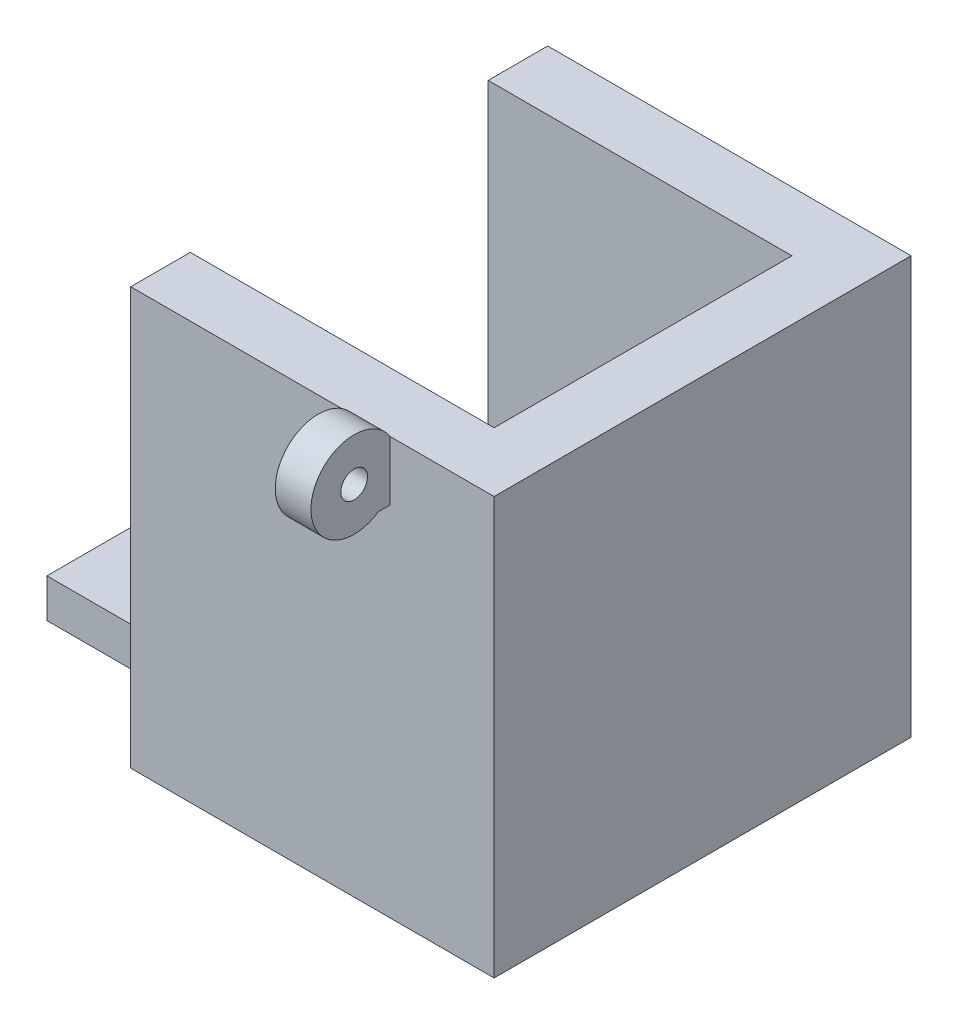
ISO-10303-21;
HEADER;
FILE_DESCRIPTION(('STEP AP214'),'2;1');
FILE_NAME('part.step','',(''),(''),'','','');
FILE_SCHEMA(('AUTOMOTIVE_DESIGN { 1 0 10303 214 1 1 1 1 }'));
ENDSEC;
DATA;
#1=APPLICATION_CONTEXT('core data for automotive mechanical design processes');
#2=APPLICATION_PROTOCOL_DEFINITION('international standard','automotive_design',2000,#1);
#3=PRODUCT_CONTEXT('',#1,'mechanical');
#4=PRODUCT('Part','Part','',(#3));
#5=PRODUCT_RELATED_PRODUCT_CATEGORY('part','',(#4));
#6=PRODUCT_DEFINITION_FORMATION('','',#4);
#7=PRODUCT_DEFINITION_CONTEXT('part definition',#1,'design');
#8=PRODUCT_DEFINITION('design','',#6,#7);
#9=PRODUCT_DEFINITION_SHAPE('','',#8);
#10=(LENGTH_UNIT() NAMED_UNIT(*) SI_UNIT(.MILLI.,.METRE.));
#11=(NAMED_UNIT(*) PLANE_ANGLE_UNIT() SI_UNIT($,.RADIAN.));
#12=(NAMED_UNIT(*) SI_UNIT($,.STERADIAN.) SOLID_ANGLE_UNIT());
#13=UNCERTAINTY_MEASURE_WITH_UNIT(LENGTH_MEASURE(1.E-05),#10,'distance_accuracy_value','');
#14=(GEOMETRIC_REPRESENTATION_CONTEXT(3) GLOBAL_UNCERTAINTY_ASSIGNED_CONTEXT((#13)) GLOBAL_UNIT_ASSIGNED_CONTEXT((#10,
#11,#12)) REPRESENTATION_CONTEXT('',''));
#15=CARTESIAN_POINT('',(0.,0.,0.));
#16=DIRECTION('',(0.,0.,1.));
#17=DIRECTION('',(1.,0.,0.));
#18=AXIS2_PLACEMENT_3D('',#15,#16,#17);
#19=CARTESIAN_POINT('',(40.5365853658537,0.,77.3902439024391));
#20=DIRECTION('',(1.,0.,0.));
#21=DIRECTION('',(0.,0.,-1.));
#22=AXIS2_PLACEMENT_3D('',#19,#20,#21);
#23=PLANE('',#22);
#24=DIRECTION('',(0.,0.,-1.));
#25=VECTOR('',#24,1.);
#26=CARTESIAN_POINT('',(40.5365853658537,140.,77.3902439024391));
#27=LINE('',#26,#25);
#28=CARTESIAN_POINT('',(40.5365853658537,140.,-42.609756097561));
#29=VERTEX_POINT('',#28);
#30=CARTESIAN_POINT('',(40.5365853658537,140.,-62.609756097561));
#31=VERTEX_POINT('',#30);
#32=EDGE_CURVE('E171',#29,#31,#27,.T.);
#33=ORIENTED_EDGE('',*,*,#32,.T.);
#34=DIRECTION('',(0.,1.,0.));
#35=VECTOR('',#34,1.);
#36=CARTESIAN_POINT('',(40.5365853658537,0.,-62.609756097561));
#37=LINE('',#36,#35);
#38=CARTESIAN_POINT('',(40.5365853658537,0.,-62.609756097561));
#39=VERTEX_POINT('',#38);
#40=EDGE_CURVE('E183',#39,#31,#37,.T.);
#41=ORIENTED_EDGE('',*,*,#40,.F.);
#42=DIRECTION('',(0.,0.,-1.));
#43=VECTOR('',#42,1.);
#44=CARTESIAN_POINT('',(40.5365853658537,0.,77.3902439024391));
#45=LINE('',#44,#43);
#46=CARTESIAN_POINT('',(40.5365853658537,0.,77.3902439024391));
#47=VERTEX_POINT('',#46);
#48=EDGE_CURVE('E179',#47,#39,#45,.T.);
#49=ORIENTED_EDGE('',*,*,#48,.F.);
#50=DIRECTION('',(0.,1.,0.));
#51=VECTOR('',#50,1.);
#52=CARTESIAN_POINT('',(40.5365853658537,0.,77.3902439024391));
#53=LINE('',#52,#51);
#54=CARTESIAN_POINT('',(40.5365853658537,140.,77.3902439024391));
#55=VERTEX_POINT('',#54);
#56=EDGE_CURVE('E181',#47,#55,#53,.T.);
#57=ORIENTED_EDGE('',*,*,#56,.T.);
#58=CARTESIAN_POINT('',(40.5365853658537,140.,57.390243902439));
#59=VERTEX_POINT('',#58);
#60=EDGE_CURVE('E173',#55,#59,#27,.T.);
#61=ORIENTED_EDGE('',*,*,#60,.T.);
#62=DIRECTION('',(0.,1.,0.));
#63=VECTOR('',#62,1.);
#64=CARTESIAN_POINT('',(40.5365853658537,30.,57.390243902439));
#65=LINE('',#64,#63);
#66=CARTESIAN_POINT('',(40.5365853658537,30.,57.390243902439));
#67=VERTEX_POINT('',#66);
#68=EDGE_CURVE('E186',#67,#59,#65,.T.);
#69=ORIENTED_EDGE('',*,*,#68,.F.);
#70=DIRECTION('',(0.,0.,-1.));
#71=VECTOR('',#70,1.);
#72=CARTESIAN_POINT('',(40.5365853658537,30.,0.));
#73=LINE('',#72,#71);
#74=CARTESIAN_POINT('',(40.5365853658537,30.,-42.609756097561));
#75=VERTEX_POINT('',#74);
#76=EDGE_CURVE('E12',#67,#75,#73,.T.);
#77=ORIENTED_EDGE('',*,*,#76,.T.);
#78=DIRECTION('',(0.,-1.,0.));
#79=VECTOR('',#78,1.);
#80=CARTESIAN_POINT('',(40.5365853658537,30.,-42.609756097561));
#81=LINE('',#80,#79);
#82=EDGE_CURVE('E190',#29,#75,#81,.T.);
#83=ORIENTED_EDGE('',*,*,#82,.F.);
#84=EDGE_LOOP('',(#33,#41,#49,#57,#61,#69,#77,#83));
#85=FACE_BOUND('',#84,.T.);
#86=DIRECTION('',(0.,-1.,0.));
#87=VECTOR('',#86,1.);
#88=CARTESIAN_POINT('',(40.5365853658537,20.,-42.609756097561));
#89=LINE('',#88,#87);
#90=CARTESIAN_POINT('',(40.5365853658537,20.,-42.609756097561));
#91=VERTEX_POINT('',#90);
#92=CARTESIAN_POINT('',(40.5365853658537,7.,-42.609756097561));
#93=VERTEX_POINT('',#92);
#94=EDGE_CURVE('E170',#91,#93,#89,.T.);
#95=ORIENTED_EDGE('',*,*,#94,.F.);
#96=DIRECTION('',(0.,0.,-1.));
#97=VECTOR('',#96,1.);
#98=CARTESIAN_POINT('',(40.5365853658537,20.,-42.609756097561));
#99=LINE('',#98,#97);
#100=CARTESIAN_POINT('',(40.5365853658537,20.,55.5296286532583));
#101=VERTEX_POINT('',#100);
#102=EDGE_CURVE('E167',#101,#91,#99,.T.);
#103=ORIENTED_EDGE('',*,*,#102,.F.);
#104=DIRECTION('',(0.,1.,0.));
#105=VECTOR('',#104,1.);
#106=CARTESIAN_POINT('',(40.5365853658537,20.,55.5296286532583));
#107=LINE('',#106,#105);
#108=CARTESIAN_POINT('',(40.5365853658537,7.,55.5296286532583));
#109=VERTEX_POINT('',#108);
#110=EDGE_CURVE('E58',#109,#101,#107,.T.);
#111=ORIENTED_EDGE('',*,*,#110,.F.);
#112=DIRECTION('',(0.,0.,1.));
#113=VECTOR('',#112,1.);
#114=CARTESIAN_POINT('',(40.5365853658537,7.,-42.609756097561));
#115=LINE('',#114,#113);
#116=EDGE_CURVE('E53',#93,#109,#115,.T.);
#117=ORIENTED_EDGE('',*,*,#116,.F.);
#118=EDGE_LOOP('',(#95,#103,#111,#117));
#119=FACE_BOUND('',#118,.T.);
#120=ADVANCED_FACE('F38',(#85,#119),#23,.F.);
#121=CARTESIAN_POINT('',(-109.463414634146,140.,77.3902439024391));
#122=DIRECTION('',(0.,0.,-1.));
#123=DIRECTION('',(-1.,0.,0.));
#124=AXIS2_PLACEMENT_3D('',#121,#122,#123);
#125=PLANE('',#124);
#126=DIRECTION('',(1.,0.,0.));
#127=VECTOR('',#126,1.);
#128=CARTESIAN_POINT('',(-109.463414634146,140.,77.3902439024391));
#129=LINE('',#128,#127);
#130=CARTESIAN_POINT('',(115.536585365854,140.,77.3902439024391));
#131=VERTEX_POINT('',#130);
#132=EDGE_CURVE('E249',#55,#131,#129,.T.);
#133=ORIENTED_EDGE('',*,*,#132,.F.);
#134=ORIENTED_EDGE('',*,*,#56,.F.);
#135=DIRECTION('',(1.,0.,0.));
#136=VECTOR('',#135,1.);
#137=CARTESIAN_POINT('',(-109.463414634146,0.,77.3902439024391));
#138=LINE('',#137,#136);
#139=CARTESIAN_POINT('',(162.536585365854,0.,77.3902439024391));
#140=VERTEX_POINT('',#139);
#141=EDGE_CURVE('E246',#47,#140,#138,.T.);
#142=ORIENTED_EDGE('',*,*,#141,.T.);
#143=DIRECTION('',(0.,-1.,0.));
#144=VECTOR('',#143,1.);
#145=CARTESIAN_POINT('',(162.536585365854,140.,77.3902439024391));
#146=LINE('',#145,#144);
#147=CARTESIAN_POINT('',(162.536585365854,140.,77.3902439024391));
#148=VERTEX_POINT('',#147);
#149=EDGE_CURVE('E46',#148,#140,#146,.T.);
#150=ORIENTED_EDGE('',*,*,#149,.F.);
#151=CARTESIAN_POINT('',(127.536585365854,140.,77.3902439024391));
#152=VERTEX_POINT('',#151);
#153=EDGE_CURVE('E252',#152,#148,#129,.T.);
#154=ORIENTED_EDGE('',*,*,#153,.F.);
#155=DIRECTION('',(0.,1.,0.));
#156=VECTOR('',#155,1.);
#157=CARTESIAN_POINT('',(127.536585365854,132.,77.3902439024391));
#158=LINE('',#157,#156);
#159=CARTESIAN_POINT('',(127.536585365854,120.,77.3902439024391));
#160=VERTEX_POINT('',#159);
#161=EDGE_CURVE('E220',#160,#152,#158,.T.);
#162=ORIENTED_EDGE('',*,*,#161,.F.);
#163=DIRECTION('',(1.,0.,0.));
#164=VECTOR('',#163,1.);
#165=CARTESIAN_POINT('',(115.536585365854,120.,77.3902439024391));
#166=LINE('',#165,#164);
#167=CARTESIAN_POINT('',(115.536585365854,120.,77.3902439024391));
#168=VERTEX_POINT('',#167);
#169=EDGE_CURVE('E217',#168,#160,#166,.T.);
#170=ORIENTED_EDGE('',*,*,#169,.F.);
#171=DIRECTION('',(0.,-1.,0.));
#172=VECTOR('',#171,1.);
#173=CARTESIAN_POINT('',(115.536585365854,132.,77.3902439024391));
#174=LINE('',#173,#172);
#175=EDGE_CURVE('E215',#131,#168,#174,.T.);
#176=ORIENTED_EDGE('',*,*,#175,.F.);
#177=EDGE_LOOP('',(#133,#134,#142,#150,#154,#162,#170,#176));
#178=FACE_BOUND('',#177,.T.);
#179=ADVANCED_FACE('F40',(#178),#125,.F.);
#180=CARTESIAN_POINT('',(0.,140.,0.));
#181=DIRECTION('',(0.,1.,0.));
#182=DIRECTION('',(0.,0.,1.));
#183=AXIS2_PLACEMENT_3D('',#180,#181,#182);
#184=PLANE('',#183);
#185=ORIENTED_EDGE('',*,*,#60,.F.);
#186=ORIENTED_EDGE('',*,*,#132,.T.);
#187=DIRECTION('',(0.,0.,-1.));
#188=VECTOR('',#187,1.);
#189=CARTESIAN_POINT('',(115.536585365854,140.,0.));
#190=LINE('',#189,#188);
#191=CARTESIAN_POINT('',(115.536585365854,140.,77.3088491154122));
#192=VERTEX_POINT('',#191);
#193=EDGE_CURVE('E207',#131,#192,#190,.T.);
#194=ORIENTED_EDGE('',*,*,#193,.T.);
#195=DIRECTION('',(1.,0.,0.));
#196=VECTOR('',#195,1.);
#197=CARTESIAN_POINT('',(115.536585365854,140.,77.3088491154122));
#198=LINE('',#197,#196);
#199=CARTESIAN_POINT('',(127.536585365854,140.,77.3088491154122));
#200=VERTEX_POINT('',#199);
#201=EDGE_CURVE('E212',#200,#192,#198,.F.);
#202=ORIENTED_EDGE('',*,*,#201,.F.);
#203=DIRECTION('',(0.,0.,-1.));
#204=VECTOR('',#203,1.);
#205=CARTESIAN_POINT('',(127.536585365854,140.,0.));
#206=LINE('',#205,#204);
#207=EDGE_CURVE('E202',#152,#200,#206,.T.);
#208=ORIENTED_EDGE('',*,*,#207,.F.);
#209=ORIENTED_EDGE('',*,*,#153,.T.);
#210=DIRECTION('',(0.,0.,-1.));
#211=VECTOR('',#210,1.);
#212=CARTESIAN_POINT('',(162.536585365854,140.,-62.609756097561));
#213=LINE('',#212,#211);
#214=CARTESIAN_POINT('',(162.536585365854,140.,-62.609756097561));
#215=VERTEX_POINT('',#214);
#216=EDGE_CURVE('E251',#148,#215,#213,.T.);
#217=ORIENTED_EDGE('',*,*,#216,.T.);
#218=DIRECTION('',(-1.,0.,0.));
#219=VECTOR('',#218,1.);
#220=CARTESIAN_POINT('',(-109.463414634146,140.,-62.609756097561));
#221=LINE('',#220,#219);
#222=EDGE_CURVE('E254',#215,#31,#221,.T.);
#223=ORIENTED_EDGE('',*,*,#222,.T.);
#224=ORIENTED_EDGE('',*,*,#32,.F.);
#225=DIRECTION('',(-1.,0.,0.));
#226=VECTOR('',#225,1.);
#227=CARTESIAN_POINT('',(-109.463414634146,140.,-42.609756097561));
#228=LINE('',#227,#226);
#229=CARTESIAN_POINT('',(142.536585365854,140.,-42.609756097561));
#230=VERTEX_POINT('',#229);
#231=EDGE_CURVE('E231',#230,#29,#228,.T.);
#232=ORIENTED_EDGE('',*,*,#231,.F.);
#233=DIRECTION('',(0.,0.,-1.));
#234=VECTOR('',#233,1.);
#235=CARTESIAN_POINT('',(142.536585365854,140.,-42.609756097561));
#236=LINE('',#235,#234);
#237=CARTESIAN_POINT('',(142.536585365854,140.,57.390243902439));
#238=VERTEX_POINT('',#237);
#239=EDGE_CURVE('E239',#238,#230,#236,.T.);
#240=ORIENTED_EDGE('',*,*,#239,.F.);
#241=DIRECTION('',(1.,0.,0.));
#242=VECTOR('',#241,1.);
#243=CARTESIAN_POINT('',(-109.463414634146,140.,57.390243902439));
#244=LINE('',#243,#242);
#245=EDGE_CURVE('E227',#59,#238,#244,.T.);
#246=ORIENTED_EDGE('',*,*,#245,.F.);
#247=EDGE_LOOP('',(#185,#186,#194,#202,#208,#209,#217,#223,#224,#232,#240,#246));
#248=FACE_BOUND('',#247,.T.);
#249=ADVANCED_FACE('F284',(#248),#184,.T.);
#250=CARTESIAN_POINT('',(162.536585365854,140.,-62.609756097561));
#251=DIRECTION('',(-1.,0.,0.));
#252=DIRECTION('',(0.,0.,1.));
#253=AXIS2_PLACEMENT_3D('',#250,#251,#252);
#254=PLANE('',#253);
#255=DIRECTION('',(0.,0.,-1.));
#256=VECTOR('',#255,1.);
#257=CARTESIAN_POINT('',(162.536585365854,0.,-62.609756097561));
#258=LINE('',#257,#256);
#259=CARTESIAN_POINT('',(162.536585365854,0.,-62.609756097561));
#260=VERTEX_POINT('',#259);
#261=EDGE_CURVE('E259',#140,#260,#258,.T.);
#262=ORIENTED_EDGE('',*,*,#261,.T.);
#263=DIRECTION('',(0.,-1.,0.));
#264=VECTOR('',#263,1.);
#265=CARTESIAN_POINT('',(162.536585365854,140.,-62.609756097561));
#266=LINE('',#265,#264);
#267=EDGE_CURVE('E257',#215,#260,#266,.T.);
#268=ORIENTED_EDGE('',*,*,#267,.F.);
#269=ORIENTED_EDGE('',*,*,#216,.F.);
#270=ORIENTED_EDGE('',*,*,#149,.T.);
#271=EDGE_LOOP('',(#262,#268,#269,#270));
#272=FACE_BOUND('',#271,.T.);
#273=ADVANCED_FACE('F270',(#272),#254,.F.);
#274=CARTESIAN_POINT('',(-109.463414634146,140.,-62.609756097561));
#275=DIRECTION('',(0.,0.,1.));
#276=DIRECTION('',(1.,0.,0.));
#277=AXIS2_PLACEMENT_3D('',#274,#275,#276);
#278=PLANE('',#277);
#279=DIRECTION('',(-1.,0.,0.));
#280=VECTOR('',#279,1.);
#281=CARTESIAN_POINT('',(-109.463414634146,0.,-62.609756097561));
#282=LINE('',#281,#280);
#283=EDGE_CURVE('E261',#260,#39,#282,.T.);
#284=ORIENTED_EDGE('',*,*,#283,.T.);
#285=ORIENTED_EDGE('',*,*,#40,.T.);
#286=ORIENTED_EDGE('',*,*,#222,.F.);
#287=ORIENTED_EDGE('',*,*,#267,.T.);
#288=EDGE_LOOP('',(#284,#285,#286,#287));
#289=FACE_BOUND('',#288,.T.);
#290=ADVANCED_FACE('F279',(#289),#278,.F.);
#291=CARTESIAN_POINT('',(0.,0.,0.));
#292=DIRECTION('',(0.,1.,0.));
#293=DIRECTION('',(0.,0.,1.));
#294=AXIS2_PLACEMENT_3D('',#291,#292,#293);
#295=PLANE('',#294);
#296=ORIENTED_EDGE('',*,*,#141,.F.);
#297=ORIENTED_EDGE('',*,*,#48,.T.);
#298=ORIENTED_EDGE('',*,*,#283,.F.);
#299=ORIENTED_EDGE('',*,*,#261,.F.);
#300=EDGE_LOOP('',(#296,#297,#298,#299));
#301=FACE_BOUND('',#300,.T.);
#302=ADVANCED_FACE('F277',(#301),#295,.F.);
#303=CARTESIAN_POINT('',(-109.463414634146,30.,-42.609756097561));
#304=DIRECTION('',(0.,0.,-1.));
#305=DIRECTION('',(-1.,0.,0.));
#306=AXIS2_PLACEMENT_3D('',#303,#304,#305);
#307=PLANE('',#306);
#308=ORIENTED_EDGE('',*,*,#231,.T.);
#309=ORIENTED_EDGE('',*,*,#82,.T.);
#310=DIRECTION('',(-1.,0.,0.));
#311=VECTOR('',#310,1.);
#312=CARTESIAN_POINT('',(-109.463414634146,30.,-42.609756097561));
#313=LINE('',#312,#311);
#314=CARTESIAN_POINT('',(142.536585365854,30.,-42.609756097561));
#315=VERTEX_POINT('',#314);
#316=EDGE_CURVE('E234',#315,#75,#313,.T.);
#317=ORIENTED_EDGE('',*,*,#316,.F.);
#318=DIRECTION('',(0.,1.,0.));
#319=VECTOR('',#318,1.);
#320=CARTESIAN_POINT('',(142.536585365854,30.,-42.609756097561));
#321=LINE('',#320,#319);
#322=EDGE_CURVE('E244',#315,#230,#321,.T.);
#323=ORIENTED_EDGE('',*,*,#322,.T.);
#324=EDGE_LOOP('',(#308,#309,#317,#323));
#325=FACE_BOUND('',#324,.T.);
#326=ADVANCED_FACE('F315',(#325),#307,.F.);
#327=CARTESIAN_POINT('',(142.536585365854,30.,-42.609756097561));
#328=DIRECTION('',(1.,0.,0.));
#329=DIRECTION('',(0.,0.,-1.));
#330=AXIS2_PLACEMENT_3D('',#327,#328,#329);
#331=PLANE('',#330);
#332=ORIENTED_EDGE('',*,*,#239,.T.);
#333=ORIENTED_EDGE('',*,*,#322,.F.);
#334=DIRECTION('',(0.,0.,-1.));
#335=VECTOR('',#334,1.);
#336=CARTESIAN_POINT('',(142.536585365854,30.,-42.609756097561));
#337=LINE('',#336,#335);
#338=CARTESIAN_POINT('',(142.536585365854,30.,57.390243902439));
#339=VERTEX_POINT('',#338);
#340=EDGE_CURVE('E230',#339,#315,#337,.T.);
#341=ORIENTED_EDGE('',*,*,#340,.F.);
#342=DIRECTION('',(0.,1.,0.));
#343=VECTOR('',#342,1.);
#344=CARTESIAN_POINT('',(142.536585365854,30.,57.390243902439));
#345=LINE('',#344,#343);
#346=EDGE_CURVE('E237',#339,#238,#345,.T.);
#347=ORIENTED_EDGE('',*,*,#346,.T.);
#348=EDGE_LOOP('',(#332,#333,#341,#347));
#349=FACE_BOUND('',#348,.T.);
#350=ADVANCED_FACE('F317',(#349),#331,.F.);
#351=CARTESIAN_POINT('',(-109.463414634146,30.,57.390243902439));
#352=DIRECTION('',(0.,0.,1.));
#353=DIRECTION('',(1.,0.,0.));
#354=AXIS2_PLACEMENT_3D('',#351,#352,#353);
#355=PLANE('',#354);
#356=DIRECTION('',(1.,0.,0.));
#357=VECTOR('',#356,1.);
#358=CARTESIAN_POINT('',(-109.463414634146,30.,57.390243902439));
#359=LINE('',#358,#357);
#360=EDGE_CURVE('E228',#67,#339,#359,.T.);
#361=ORIENTED_EDGE('',*,*,#360,.F.);
#362=ORIENTED_EDGE('',*,*,#68,.T.);
#363=ORIENTED_EDGE('',*,*,#245,.T.);
#364=ORIENTED_EDGE('',*,*,#346,.F.);
#365=EDGE_LOOP('',(#361,#362,#363,#364));
#366=FACE_BOUND('',#365,.T.);
#367=ADVANCED_FACE('F308',(#366),#355,.F.);
#368=CARTESIAN_POINT('',(0.,30.,0.));
#369=DIRECTION('',(0.,1.,0.));
#370=DIRECTION('',(0.,0.,1.));
#371=AXIS2_PLACEMENT_3D('',#368,#369,#370);
#372=PLANE('',#371);
#373=ORIENTED_EDGE('',*,*,#76,.F.);
#374=ORIENTED_EDGE('',*,*,#360,.T.);
#375=ORIENTED_EDGE('',*,*,#340,.T.);
#376=ORIENTED_EDGE('',*,*,#316,.T.);
#377=EDGE_LOOP('',(#373,#374,#375,#376));
#378=FACE_BOUND('',#377,.T.);
#379=ADVANCED_FACE('F312',(#378),#372,.T.);
#380=CARTESIAN_POINT('',(115.536585365854,132.,87.3902439024391));
#381=DIRECTION('',(1.,0.,0.));
#382=DIRECTION('',(0.,0.,-1.));
#383=AXIS2_PLACEMENT_3D('',#380,#381,#382);
#384=PLANE('',#383);
#385=DIRECTION('',(0.,0.,-1.));
#386=VECTOR('',#385,1.);
#387=CARTESIAN_POINT('',(115.536585365854,120.,87.3902439024391));
#388=LINE('',#387,#386);
#389=CARTESIAN_POINT('',(115.536585365854,120.,81.2686615443022));
#390=VERTEX_POINT('',#389);
#391=EDGE_CURVE('E224',#390,#168,#388,.T.);
#392=ORIENTED_EDGE('',*,*,#391,.F.);
#393=CARTESIAN_POINT('',(115.536585365854,132.,89.3902439024391));
#394=DIRECTION('',(1.,0.,0.));
#395=DIRECTION('',(0.,0.,-1.));
#396=AXIS2_PLACEMENT_3D('',#393,#394,#395);
#397=CIRCLE('',#396,14.49);
#398=EDGE_CURVE('E200',#192,#390,#397,.T.);
#399=ORIENTED_EDGE('',*,*,#398,.F.);
#400=ORIENTED_EDGE('',*,*,#193,.F.);
#401=ORIENTED_EDGE('',*,*,#175,.T.);
#402=EDGE_LOOP('',(#392,#399,#400,#401));
#403=FACE_BOUND('',#402,.T.);
#404=CARTESIAN_POINT('',(115.536585365854,132.,89.3902439024391));
#405=DIRECTION('',(1.,0.,0.));
#406=DIRECTION('',(0.,0.,-1.));
#407=AXIS2_PLACEMENT_3D('',#404,#405,#406);
#408=CIRCLE('',#407,4.48999999999999);
#409=CARTESIAN_POINT('',(115.536585365854,132.,84.9002439024391));
#410=VERTEX_POINT('',#409);
#411=EDGE_CURVE('E194',#410,#410,#408,.T.);
#412=ORIENTED_EDGE('',*,*,#411,.T.);
#413=EDGE_LOOP('',(#412));
#414=FACE_BOUND('',#413,.T.);
#415=ADVANCED_FACE('F298',(#403,#414),#384,.F.);
#416=CARTESIAN_POINT('',(115.536585365854,120.,87.3902439024391));
#417=DIRECTION('',(0.,1.,0.));
#418=DIRECTION('',(0.,0.,1.));
#419=AXIS2_PLACEMENT_3D('',#416,#417,#418);
#420=PLANE('',#419);
#421=DIRECTION('',(0.,0.,-1.));
#422=VECTOR('',#421,1.);
#423=CARTESIAN_POINT('',(127.536585365854,120.,87.3902439024391));
#424=LINE('',#423,#422);
#425=CARTESIAN_POINT('',(127.536585365854,120.,81.2686615443022));
#426=VERTEX_POINT('',#425);
#427=EDGE_CURVE('E222',#426,#160,#424,.T.);
#428=ORIENTED_EDGE('',*,*,#427,.F.);
#429=DIRECTION('',(1.,0.,0.));
#430=VECTOR('',#429,1.);
#431=CARTESIAN_POINT('',(115.536585365854,120.,81.2686615443022));
#432=LINE('',#431,#430);
#433=EDGE_CURVE('E209',#426,#390,#432,.F.);
#434=ORIENTED_EDGE('',*,*,#433,.T.);
#435=ORIENTED_EDGE('',*,*,#391,.T.);
#436=ORIENTED_EDGE('',*,*,#169,.T.);
#437=EDGE_LOOP('',(#428,#434,#435,#436));
#438=FACE_BOUND('',#437,.T.);
#439=ADVANCED_FACE('F294',(#438),#420,.F.);
#440=CARTESIAN_POINT('',(127.536585365854,132.,87.3902439024391));
#441=DIRECTION('',(-1.,0.,0.));
#442=DIRECTION('',(0.,0.,1.));
#443=AXIS2_PLACEMENT_3D('',#440,#441,#442);
#444=PLANE('',#443);
#445=CARTESIAN_POINT('',(127.536585365854,132.,89.3902439024391));
#446=DIRECTION('',(1.,0.,0.));
#447=DIRECTION('',(0.,0.,-1.));
#448=AXIS2_PLACEMENT_3D('',#445,#446,#447);
#449=CIRCLE('',#448,14.49);
#450=EDGE_CURVE('E197',#200,#426,#449,.T.);
#451=ORIENTED_EDGE('',*,*,#450,.T.);
#452=ORIENTED_EDGE('',*,*,#427,.T.);
#453=ORIENTED_EDGE('',*,*,#161,.T.);
#454=ORIENTED_EDGE('',*,*,#207,.T.);
#455=EDGE_LOOP('',(#451,#452,#453,#454));
#456=FACE_BOUND('',#455,.T.);
#457=CARTESIAN_POINT('',(127.536585365854,132.,89.3902439024391));
#458=DIRECTION('',(1.,0.,0.));
#459=DIRECTION('',(0.,0.,-1.));
#460=AXIS2_PLACEMENT_3D('',#457,#458,#459);
#461=CIRCLE('',#460,4.48999999999999);
#462=CARTESIAN_POINT('',(127.536585365854,132.,84.9002439024391));
#463=VERTEX_POINT('',#462);
#464=EDGE_CURVE('E193',#463,#463,#461,.T.);
#465=ORIENTED_EDGE('',*,*,#464,.F.);
#466=EDGE_LOOP('',(#465));
#467=FACE_BOUND('',#466,.T.);
#468=ADVANCED_FACE('F338',(#456,#467),#444,.F.);
#469=CARTESIAN_POINT('',(115.536585365854,132.,89.3902439024391));
#470=DIRECTION('',(1.,0.,0.));
#471=DIRECTION('',(0.,0.,-1.));
#472=AXIS2_PLACEMENT_3D('',#469,#470,#471);
#473=CYLINDRICAL_SURFACE('',#472,4.48999999999999);
#474=ORIENTED_EDGE('',*,*,#464,.T.);
#475=EDGE_LOOP('',(#474));
#476=FACE_BOUND('',#475,.T.);
#477=ORIENTED_EDGE('',*,*,#411,.F.);
#478=EDGE_LOOP('',(#477));
#479=FACE_BOUND('',#478,.T.);
#480=ADVANCED_FACE('F334',(#476,#479),#473,.F.);
#481=CARTESIAN_POINT('',(115.536585365854,132.,89.3902439024391));
#482=DIRECTION('',(1.,0.,0.));
#483=DIRECTION('',(0.,0.,-1.));
#484=AXIS2_PLACEMENT_3D('',#481,#482,#483);
#485=CYLINDRICAL_SURFACE('',#484,14.49);
#486=ORIENTED_EDGE('',*,*,#450,.F.);
#487=ORIENTED_EDGE('',*,*,#201,.T.);
#488=ORIENTED_EDGE('',*,*,#398,.T.);
#489=ORIENTED_EDGE('',*,*,#433,.F.);
#490=EDGE_LOOP('',(#486,#487,#488,#489));
#491=FACE_BOUND('',#490,.T.);
#492=ADVANCED_FACE('F337',(#491),#485,.T.);
#493=CARTESIAN_POINT('',(-9.46341463414629,20.,-42.609756097561));
#494=DIRECTION('',(0.,0.,1.));
#495=DIRECTION('',(1.,0.,0.));
#496=AXIS2_PLACEMENT_3D('',#493,#494,#495);
#497=PLANE('',#496);
#498=ORIENTED_EDGE('',*,*,#94,.T.);
#499=DIRECTION('',(1.,0.,0.));
#500=VECTOR('',#499,1.);
#501=CARTESIAN_POINT('',(-9.46341463414629,7.,-42.609756097561));
#502=LINE('',#501,#500);
#503=CARTESIAN_POINT('',(-9.46341463414629,7.,-42.609756097561));
#504=VERTEX_POINT('',#503);
#505=EDGE_CURVE('E151',#504,#93,#502,.T.);
#506=ORIENTED_EDGE('',*,*,#505,.F.);
#507=DIRECTION('',(0.,-1.,0.));
#508=VECTOR('',#507,1.);
#509=CARTESIAN_POINT('',(-9.46341463414629,20.,-42.609756097561));
#510=LINE('',#509,#508);
#511=CARTESIAN_POINT('',(-9.46341463414629,20.,-42.609756097561));
#512=VERTEX_POINT('',#511);
#513=EDGE_CURVE('E158',#512,#504,#510,.T.);
#514=ORIENTED_EDGE('',*,*,#513,.F.);
#515=DIRECTION('',(1.,0.,0.));
#516=VECTOR('',#515,1.);
#517=CARTESIAN_POINT('',(-9.46341463414629,20.,-42.609756097561));
#518=LINE('',#517,#516);
#519=EDGE_CURVE('E517',#512,#91,#518,.T.);
#520=ORIENTED_EDGE('',*,*,#519,.T.);
#521=EDGE_LOOP('',(#498,#506,#514,#520));
#522=FACE_BOUND('',#521,.T.);
#523=ADVANCED_FACE('F169',(#522),#497,.F.);
#524=CARTESIAN_POINT('',(-9.46341463414629,7.,-42.609756097561));
#525=DIRECTION('',(0.,1.,0.));
#526=DIRECTION('',(0.,0.,1.));
#527=AXIS2_PLACEMENT_3D('',#524,#525,#526);
#528=PLANE('',#527);
#529=CARTESIAN_POINT('',(10.5365853658537,7.,7.39024390243905));
#530=DIRECTION('',(0.,1.,0.));
#531=DIRECTION('',(0.,0.,1.));
#532=AXIS2_PLACEMENT_3D('',#529,#530,#531);
#533=CIRCLE('',#532,3.);
#534=CARTESIAN_POINT('',(10.5365853658537,7.,10.390243902439));
#535=VERTEX_POINT('',#534);
#536=EDGE_CURVE('E511',#535,#535,#533,.T.);
#537=ORIENTED_EDGE('',*,*,#536,.T.);
#538=EDGE_LOOP('',(#537));
#539=FACE_BOUND('',#538,.T.);
#540=ORIENTED_EDGE('',*,*,#116,.T.);
#541=DIRECTION('',(1.,0.,0.));
#542=VECTOR('',#541,1.);
#543=CARTESIAN_POINT('',(-9.46341463414629,7.,55.5296286532583));
#544=LINE('',#543,#542);
#545=CARTESIAN_POINT('',(-9.46341463414629,7.,55.5296286532583));
#546=VERTEX_POINT('',#545);
#547=EDGE_CURVE('E154',#546,#109,#544,.T.);
#548=ORIENTED_EDGE('',*,*,#547,.F.);
#549=DIRECTION('',(0.,0.,1.));
#550=VECTOR('',#549,1.);
#551=CARTESIAN_POINT('',(-9.46341463414629,7.,-42.609756097561));
#552=LINE('',#551,#550);
#553=EDGE_CURVE('E147',#504,#546,#552,.T.);
#554=ORIENTED_EDGE('',*,*,#553,.F.);
#555=ORIENTED_EDGE('',*,*,#505,.T.);
#556=EDGE_LOOP('',(#540,#548,#554,#555));
#557=FACE_BOUND('',#556,.T.);
#558=ADVANCED_FACE('F149',(#539,#557),#528,.F.);
#559=CARTESIAN_POINT('',(-9.46341463414629,20.,55.5296286532583));
#560=DIRECTION('',(0.,0.,-1.));
#561=DIRECTION('',(-1.,0.,0.));
#562=AXIS2_PLACEMENT_3D('',#559,#560,#561);
#563=PLANE('',#562);
#564=ORIENTED_EDGE('',*,*,#110,.T.);
#565=DIRECTION('',(1.,0.,0.));
#566=VECTOR('',#565,1.);
#567=CARTESIAN_POINT('',(-9.46341463414629,20.,55.5296286532583));
#568=LINE('',#567,#566);
#569=CARTESIAN_POINT('',(-9.46341463414629,20.,55.5296286532583));
#570=VERTEX_POINT('',#569);
#571=EDGE_CURVE('E175',#570,#101,#568,.T.);
#572=ORIENTED_EDGE('',*,*,#571,.F.);
#573=DIRECTION('',(0.,1.,0.));
#574=VECTOR('',#573,1.);
#575=CARTESIAN_POINT('',(-9.46341463414629,20.,55.5296286532583));
#576=LINE('',#575,#574);
#577=EDGE_CURVE('E157',#546,#570,#576,.T.);
#578=ORIENTED_EDGE('',*,*,#577,.F.);
#579=ORIENTED_EDGE('',*,*,#547,.T.);
#580=EDGE_LOOP('',(#564,#572,#578,#579));
#581=FACE_BOUND('',#580,.T.);
#582=ADVANCED_FACE('F387',(#581),#563,.F.);
#583=CARTESIAN_POINT('',(-9.46341463414629,20.,-42.609756097561));
#584=DIRECTION('',(0.,-1.,0.));
#585=DIRECTION('',(0.,0.,-1.));
#586=AXIS2_PLACEMENT_3D('',#583,#584,#585);
#587=PLANE('',#586);
#588=CARTESIAN_POINT('',(10.5365853658537,20.,7.39024390243905));
#589=DIRECTION('',(0.,1.,0.));
#590=DIRECTION('',(0.,0.,1.));
#591=AXIS2_PLACEMENT_3D('',#588,#589,#590);
#592=CIRCLE('',#591,3.);
#593=CARTESIAN_POINT('',(10.5365853658537,20.,10.390243902439));
#594=VERTEX_POINT('',#593);
#595=EDGE_CURVE('E508',#594,#594,#592,.T.);
#596=ORIENTED_EDGE('',*,*,#595,.F.);
#597=EDGE_LOOP('',(#596));
#598=FACE_BOUND('',#597,.T.);
#599=ORIENTED_EDGE('',*,*,#102,.T.);
#600=ORIENTED_EDGE('',*,*,#519,.F.);
#601=DIRECTION('',(0.,0.,-1.));
#602=VECTOR('',#601,1.);
#603=CARTESIAN_POINT('',(-9.46341463414629,20.,-42.609756097561));
#604=LINE('',#603,#602);
#605=EDGE_CURVE('E163',#570,#512,#604,.T.);
#606=ORIENTED_EDGE('',*,*,#605,.F.);
#607=ORIENTED_EDGE('',*,*,#571,.T.);
#608=EDGE_LOOP('',(#599,#600,#606,#607));
#609=FACE_BOUND('',#608,.T.);
#610=ADVANCED_FACE('F395',(#598,#609),#587,.F.);
#611=CARTESIAN_POINT('',(-9.46341463414629,0.,0.));
#612=DIRECTION('',(-1.,0.,0.));
#613=DIRECTION('',(0.,0.,1.));
#614=AXIS2_PLACEMENT_3D('',#611,#612,#613);
#615=PLANE('',#614);
#616=ORIENTED_EDGE('',*,*,#513,.T.);
#617=ORIENTED_EDGE('',*,*,#553,.T.);
#618=ORIENTED_EDGE('',*,*,#577,.T.);
#619=ORIENTED_EDGE('',*,*,#605,.T.);
#620=EDGE_LOOP('',(#616,#617,#618,#619));
#621=FACE_BOUND('',#620,.T.);
#622=ADVANCED_FACE('F161',(#621),#615,.T.);
#623=CARTESIAN_POINT('',(10.5365853658537,0.,7.39024390243905));
#624=DIRECTION('',(0.,1.,0.));
#625=DIRECTION('',(0.,0.,1.));
#626=AXIS2_PLACEMENT_3D('',#623,#624,#625);
#627=CYLINDRICAL_SURFACE('',#626,3.);
#628=ORIENTED_EDGE('',*,*,#595,.T.);
#629=EDGE_LOOP('',(#628));
#630=FACE_BOUND('',#629,.T.);
#631=ORIENTED_EDGE('',*,*,#536,.F.);
#632=EDGE_LOOP('',(#631));
#633=FACE_BOUND('',#632,.T.);
#634=ADVANCED_FACE('F409',(#630,#633),#627,.F.);
#635=CLOSED_SHELL('',(#120,#179,#249,#273,#290,#302,#326,#350,#367,#379,#415,#439,#468,#480,
#492,#523,#558,#582,#610,#622,#634));
#636=MANIFOLD_SOLID_BREP('B2',#635);
#637=ADVANCED_BREP_SHAPE_REPRESENTATION('',(#18,#636),#14);
#638=SHAPE_DEFINITION_REPRESENTATION(#9,#637);
ENDSEC;
END-ISO-10303-21;
